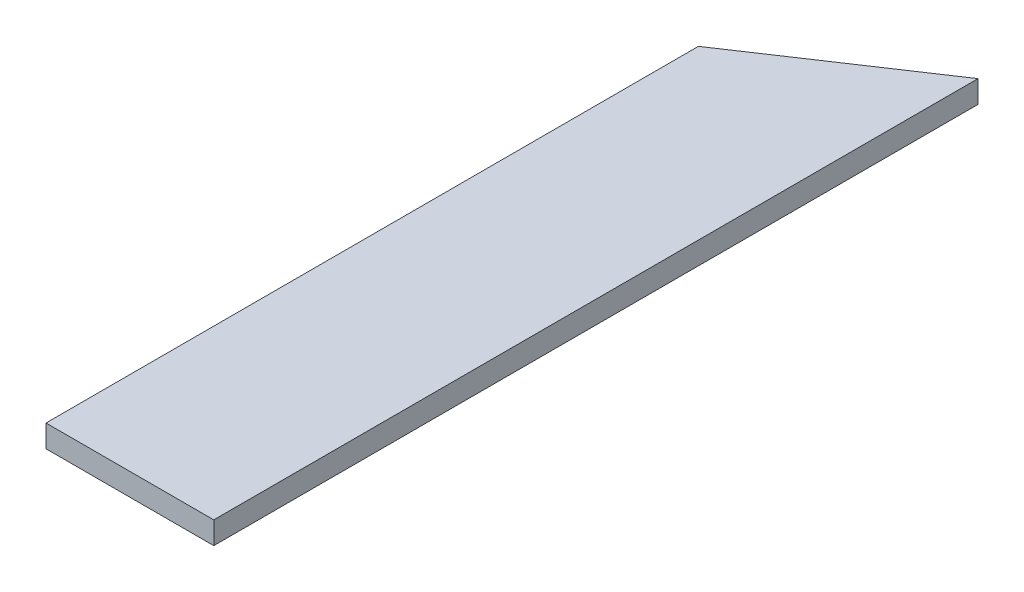
ISO-10303-21;
HEADER;
FILE_DESCRIPTION(('STEP AP214'),'2;1');
FILE_NAME('part.step','',(''),(''),'','','');
FILE_SCHEMA(('AUTOMOTIVE_DESIGN { 1 0 10303 214 1 1 1 1 }'));
ENDSEC;
DATA;
#1=APPLICATION_CONTEXT('core data for automotive mechanical design processes');
#2=APPLICATION_PROTOCOL_DEFINITION('international standard','automotive_design',2000,#1);
#3=PRODUCT_CONTEXT('',#1,'mechanical');
#4=PRODUCT('Part','Part','',(#3));
#5=PRODUCT_RELATED_PRODUCT_CATEGORY('part','',(#4));
#6=PRODUCT_DEFINITION_FORMATION('','',#4);
#7=PRODUCT_DEFINITION_CONTEXT('part definition',#1,'design');
#8=PRODUCT_DEFINITION('design','',#6,#7);
#9=PRODUCT_DEFINITION_SHAPE('','',#8);
#10=(LENGTH_UNIT() NAMED_UNIT(*) SI_UNIT(.MILLI.,.METRE.));
#11=(NAMED_UNIT(*) PLANE_ANGLE_UNIT() SI_UNIT($,.RADIAN.));
#12=(NAMED_UNIT(*) SI_UNIT($,.STERADIAN.) SOLID_ANGLE_UNIT());
#13=UNCERTAINTY_MEASURE_WITH_UNIT(LENGTH_MEASURE(1.E-05),#10,'distance_accuracy_value','');
#14=(GEOMETRIC_REPRESENTATION_CONTEXT(3) GLOBAL_UNCERTAINTY_ASSIGNED_CONTEXT((#13)) GLOBAL_UNIT_ASSIGNED_CONTEXT((#10,
#11,#12)) REPRESENTATION_CONTEXT('',''));
#15=CARTESIAN_POINT('',(0.,0.,0.));
#16=DIRECTION('',(0.,0.,1.));
#17=DIRECTION('',(1.,0.,0.));
#18=AXIS2_PLACEMENT_3D('',#15,#16,#17);
#19=CARTESIAN_POINT('',(-41.0307692307692,4.318,-61.5461538461538));
#20=DIRECTION('',(-0.554700196225229,0.,-0.832050294337844));
#21=DIRECTION('',(-0.832050294337844,0.,0.554700196225229));
#22=AXIS2_PLACEMENT_3D('',#19,#20,#21);
#23=PLANE('',#22);
#24=DIRECTION('',(0.,-1.,0.));
#25=VECTOR('',#24,1.);
#26=CARTESIAN_POINT('',(0.,4.318,-88.9));
#27=LINE('',#26,#25);
#28=CARTESIAN_POINT('',(0.,3.048,-88.9));
#29=VERTEX_POINT('',#28);
#30=CARTESIAN_POINT('',(0.,0.,-88.9));
#31=VERTEX_POINT('',#30);
#32=EDGE_CURVE('E42',#29,#31,#27,.T.);
#33=ORIENTED_EDGE('',*,*,#32,.F.);
#34=DIRECTION('',(0.832050294337844,0.,-0.554700196225229));
#35=VECTOR('',#34,1.);
#36=CARTESIAN_POINT('',(-41.0307692307692,3.048,-61.5461538461538));
#37=LINE('',#36,#35);
#38=CARTESIAN_POINT('',(22.86,3.048,-104.14));
#39=VERTEX_POINT('',#38);
#40=EDGE_CURVE('E74',#29,#39,#37,.T.);
#41=ORIENTED_EDGE('',*,*,#40,.T.);
#42=DIRECTION('',(0.,-1.,0.));
#43=VECTOR('',#42,1.);
#44=CARTESIAN_POINT('',(22.86,4.318,-104.14));
#45=LINE('',#44,#43);
#46=CARTESIAN_POINT('',(22.86,0.,-104.14));
#47=VERTEX_POINT('',#46);
#48=EDGE_CURVE('E56',#39,#47,#45,.T.);
#49=ORIENTED_EDGE('',*,*,#48,.T.);
#50=DIRECTION('',(0.832050294337844,0.,-0.554700196225229));
#51=VECTOR('',#50,1.);
#52=CARTESIAN_POINT('',(-41.0307692307692,0.,-61.5461538461538));
#53=LINE('',#52,#51);
#54=EDGE_CURVE('E79',#31,#47,#53,.T.);
#55=ORIENTED_EDGE('',*,*,#54,.F.);
#56=EDGE_LOOP('',(#33,#41,#49,#55));
#57=FACE_BOUND('',#56,.T.);
#58=ADVANCED_FACE('F35',(#57),#23,.T.);
#59=CARTESIAN_POINT('',(0.,4.318,0.));
#60=DIRECTION('',(-1.,0.,0.));
#61=DIRECTION('',(0.,0.,1.));
#62=AXIS2_PLACEMENT_3D('',#59,#60,#61);
#63=PLANE('',#62);
#64=DIRECTION('',(0.,-1.,0.));
#65=VECTOR('',#64,1.);
#66=CARTESIAN_POINT('',(0.,4.318,0.));
#67=LINE('',#66,#65);
#68=CARTESIAN_POINT('',(0.,3.048,0.));
#69=VERTEX_POINT('',#68);
#70=CARTESIAN_POINT('',(0.,0.,0.));
#71=VERTEX_POINT('',#70);
#72=EDGE_CURVE('E88',#69,#71,#67,.T.);
#73=ORIENTED_EDGE('',*,*,#72,.F.);
#74=DIRECTION('',(0.,0.,-1.));
#75=VECTOR('',#74,1.);
#76=CARTESIAN_POINT('',(0.,3.048,0.));
#77=LINE('',#76,#75);
#78=EDGE_CURVE('E80',#69,#29,#77,.T.);
#79=ORIENTED_EDGE('',*,*,#78,.T.);
#80=ORIENTED_EDGE('',*,*,#32,.T.);
#81=DIRECTION('',(0.,0.,-1.));
#82=VECTOR('',#81,1.);
#83=CARTESIAN_POINT('',(0.,0.,0.));
#84=LINE('',#83,#82);
#85=EDGE_CURVE('E99',#71,#31,#84,.T.);
#86=ORIENTED_EDGE('',*,*,#85,.F.);
#87=EDGE_LOOP('',(#73,#79,#80,#86));
#88=FACE_BOUND('',#87,.T.);
#89=ADVANCED_FACE('F97',(#88),#63,.T.);
#90=CARTESIAN_POINT('',(0.,4.318,0.));
#91=DIRECTION('',(0.,0.,-1.));
#92=DIRECTION('',(-1.,0.,0.));
#93=AXIS2_PLACEMENT_3D('',#90,#91,#92);
#94=PLANE('',#93);
#95=DIRECTION('',(1.,0.,0.));
#96=VECTOR('',#95,1.);
#97=CARTESIAN_POINT('',(0.,3.048,0.));
#98=LINE('',#97,#96);
#99=CARTESIAN_POINT('',(22.86,3.048,0.));
#100=VERTEX_POINT('',#99);
#101=EDGE_CURVE('E48',#69,#100,#98,.T.);
#102=ORIENTED_EDGE('',*,*,#101,.F.);
#103=ORIENTED_EDGE('',*,*,#72,.T.);
#104=DIRECTION('',(1.,0.,0.));
#105=VECTOR('',#104,1.);
#106=CARTESIAN_POINT('',(0.,0.,0.));
#107=LINE('',#106,#105);
#108=CARTESIAN_POINT('',(22.86,0.,0.));
#109=VERTEX_POINT('',#108);
#110=EDGE_CURVE('E90',#71,#109,#107,.T.);
#111=ORIENTED_EDGE('',*,*,#110,.T.);
#112=DIRECTION('',(0.,-1.,0.));
#113=VECTOR('',#112,1.);
#114=CARTESIAN_POINT('',(22.86,4.318,0.));
#115=LINE('',#114,#113);
#116=EDGE_CURVE('E86',#100,#109,#115,.T.);
#117=ORIENTED_EDGE('',*,*,#116,.F.);
#118=EDGE_LOOP('',(#102,#103,#111,#117));
#119=FACE_BOUND('',#118,.T.);
#120=ADVANCED_FACE('F109',(#119),#94,.F.);
#121=CARTESIAN_POINT('',(22.86,4.318,0.));
#122=DIRECTION('',(-1.,0.,0.));
#123=DIRECTION('',(0.,0.,1.));
#124=AXIS2_PLACEMENT_3D('',#121,#122,#123);
#125=PLANE('',#124);
#126=DIRECTION('',(0.,0.,-1.));
#127=VECTOR('',#126,1.);
#128=CARTESIAN_POINT('',(22.86,3.048,0.));
#129=LINE('',#128,#127);
#130=EDGE_CURVE('E11',#100,#39,#129,.T.);
#131=ORIENTED_EDGE('',*,*,#130,.F.);
#132=ORIENTED_EDGE('',*,*,#116,.T.);
#133=DIRECTION('',(0.,0.,-1.));
#134=VECTOR('',#133,1.);
#135=CARTESIAN_POINT('',(22.86,0.,0.));
#136=LINE('',#135,#134);
#137=EDGE_CURVE('E84',#109,#47,#136,.T.);
#138=ORIENTED_EDGE('',*,*,#137,.T.);
#139=ORIENTED_EDGE('',*,*,#48,.F.);
#140=EDGE_LOOP('',(#131,#132,#138,#139));
#141=FACE_BOUND('',#140,.T.);
#142=ADVANCED_FACE('F82',(#141),#125,.F.);
#143=CARTESIAN_POINT('',(0.,0.,0.));
#144=DIRECTION('',(0.,1.,0.));
#145=DIRECTION('',(0.,0.,1.));
#146=AXIS2_PLACEMENT_3D('',#143,#144,#145);
#147=PLANE('',#146);
#148=ORIENTED_EDGE('',*,*,#54,.T.);
#149=ORIENTED_EDGE('',*,*,#137,.F.);
#150=ORIENTED_EDGE('',*,*,#110,.F.);
#151=ORIENTED_EDGE('',*,*,#85,.T.);
#152=EDGE_LOOP('',(#148,#149,#150,#151));
#153=FACE_BOUND('',#152,.T.);
#154=ADVANCED_FACE('F103',(#153),#147,.F.);
#155=CARTESIAN_POINT('',(0.,3.048,0.));
#156=DIRECTION('',(0.,1.,0.));
#157=DIRECTION('',(0.,0.,1.));
#158=AXIS2_PLACEMENT_3D('',#155,#156,#157);
#159=PLANE('',#158);
#160=ORIENTED_EDGE('',*,*,#78,.F.);
#161=ORIENTED_EDGE('',*,*,#101,.T.);
#162=ORIENTED_EDGE('',*,*,#130,.T.);
#163=ORIENTED_EDGE('',*,*,#40,.F.);
#164=EDGE_LOOP('',(#160,#161,#162,#163));
#165=FACE_BOUND('',#164,.T.);
#166=ADVANCED_FACE('F73',(#165),#159,.T.);
#167=CLOSED_SHELL('',(#58,#89,#120,#142,#154,#166));
#168=MANIFOLD_SOLID_BREP('B2',#167);
#169=ADVANCED_BREP_SHAPE_REPRESENTATION('',(#18,#168),#14);
#170=SHAPE_DEFINITION_REPRESENTATION(#9,#169);
ENDSEC;
END-ISO-10303-21;
